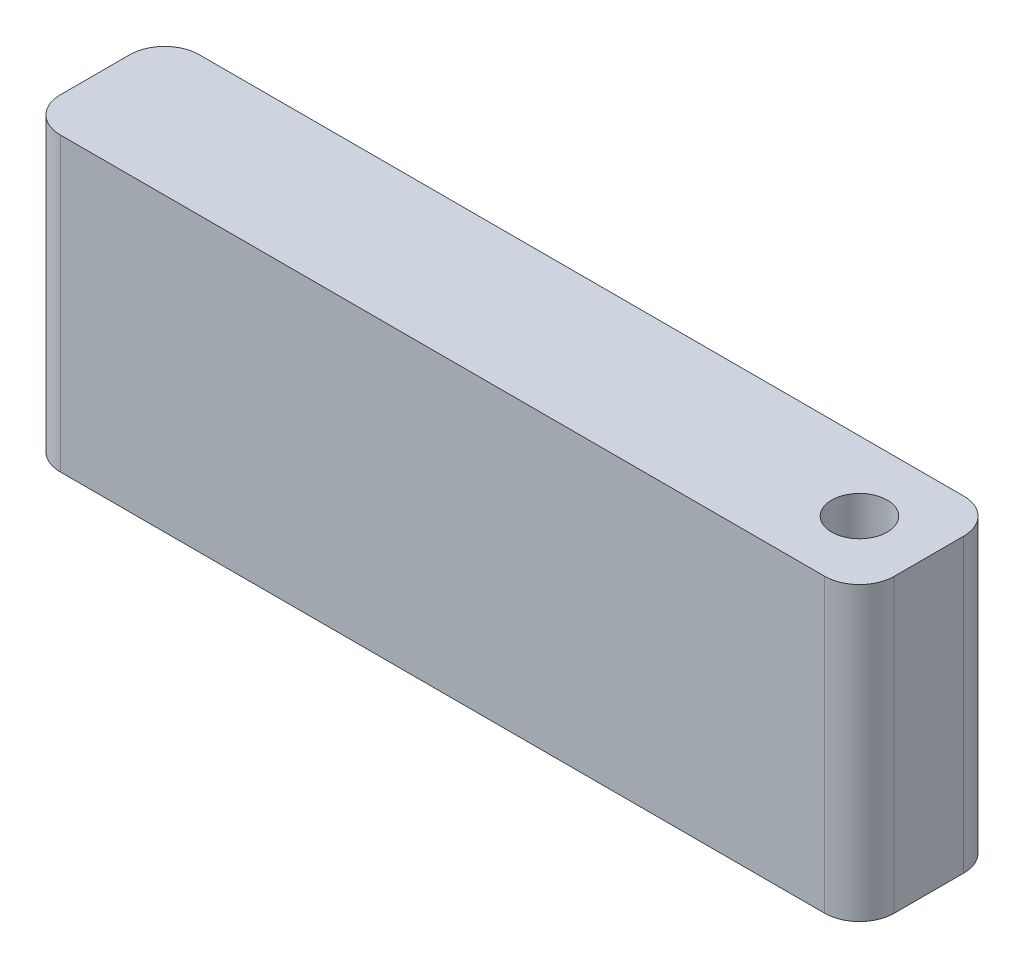
ISO-10303-21;
HEADER;
FILE_DESCRIPTION(('STEP AP214'),'2;1');
FILE_NAME('part.step','',(''),(''),'','','');
FILE_SCHEMA(('AUTOMOTIVE_DESIGN { 1 0 10303 214 1 1 1 1 }'));
ENDSEC;
DATA;
#1=APPLICATION_CONTEXT('core data for automotive mechanical design processes');
#2=APPLICATION_PROTOCOL_DEFINITION('international standard','automotive_design',2000,#1);
#3=PRODUCT_CONTEXT('',#1,'mechanical');
#4=PRODUCT('Part','Part','',(#3));
#5=PRODUCT_RELATED_PRODUCT_CATEGORY('part','',(#4));
#6=PRODUCT_DEFINITION_FORMATION('','',#4);
#7=PRODUCT_DEFINITION_CONTEXT('part definition',#1,'design');
#8=PRODUCT_DEFINITION('design','',#6,#7);
#9=PRODUCT_DEFINITION_SHAPE('','',#8);
#10=(LENGTH_UNIT() NAMED_UNIT(*) SI_UNIT(.MILLI.,.METRE.));
#11=(NAMED_UNIT(*) PLANE_ANGLE_UNIT() SI_UNIT($,.RADIAN.));
#12=(NAMED_UNIT(*) SI_UNIT($,.STERADIAN.) SOLID_ANGLE_UNIT());
#13=UNCERTAINTY_MEASURE_WITH_UNIT(LENGTH_MEASURE(1.E-05),#10,'distance_accuracy_value','');
#14=(GEOMETRIC_REPRESENTATION_CONTEXT(3) GLOBAL_UNCERTAINTY_ASSIGNED_CONTEXT((#13)) GLOBAL_UNIT_ASSIGNED_CONTEXT((#10,
#11,#12)) REPRESENTATION_CONTEXT('',''));
#15=CARTESIAN_POINT('',(0.,0.,0.));
#16=DIRECTION('',(0.,0.,1.));
#17=DIRECTION('',(1.,0.,0.));
#18=AXIS2_PLACEMENT_3D('',#15,#16,#17);
#19=CARTESIAN_POINT('',(55.,21.,-5.));
#20=DIRECTION('',(0.,-1.,0.));
#21=DIRECTION('',(0.,0.,-1.));
#22=AXIS2_PLACEMENT_3D('',#19,#20,#21);
#23=PLANE('',#22);
#24=CARTESIAN_POINT('',(55.,21.,-5.));
#25=DIRECTION('',(0.,1.,0.));
#26=DIRECTION('',(0.,0.,-1.));
#27=AXIS2_PLACEMENT_3D('',#24,#25,#26);
#28=CIRCLE('',#27,5.);
#29=CARTESIAN_POINT('',(60.,21.,-4.99999999999996));
#30=VERTEX_POINT('',#29);
#31=CARTESIAN_POINT('',(55.,21.,-10.));
#32=VERTEX_POINT('',#31);
#33=EDGE_CURVE('E146',#30,#32,#28,.T.);
#34=ORIENTED_EDGE('',*,*,#33,.T.);
#35=DIRECTION('',(-1.,0.,0.));
#36=VECTOR('',#35,1.);
#37=CARTESIAN_POINT('',(-55.,21.,-10.));
#38=LINE('',#37,#36);
#39=CARTESIAN_POINT('',(-55.,21.,-10.));
#40=VERTEX_POINT('',#39);
#41=EDGE_CURVE('E94',#32,#40,#38,.T.);
#42=ORIENTED_EDGE('',*,*,#41,.T.);
#43=CARTESIAN_POINT('',(-55.,21.,-5.));
#44=DIRECTION('',(0.,1.,0.));
#45=DIRECTION('',(0.,0.,-1.));
#46=AXIS2_PLACEMENT_3D('',#43,#44,#45);
#47=CIRCLE('',#46,5.);
#48=CARTESIAN_POINT('',(-60.,21.,-4.99999999999996));
#49=VERTEX_POINT('',#48);
#50=EDGE_CURVE('E161',#40,#49,#47,.T.);
#51=ORIENTED_EDGE('',*,*,#50,.T.);
#52=DIRECTION('',(0.,0.,1.));
#53=VECTOR('',#52,1.);
#54=CARTESIAN_POINT('',(-60.,21.,-4.99999999999996));
#55=LINE('',#54,#53);
#56=CARTESIAN_POINT('',(-60.,21.,4.99999999999997));
#57=VERTEX_POINT('',#56);
#58=EDGE_CURVE('E174',#49,#57,#55,.T.);
#59=ORIENTED_EDGE('',*,*,#58,.T.);
#60=CARTESIAN_POINT('',(-55.,21.,5.));
#61=DIRECTION('',(0.,1.,0.));
#62=DIRECTION('',(0.,0.,-1.));
#63=AXIS2_PLACEMENT_3D('',#60,#61,#62);
#64=CIRCLE('',#63,5.);
#65=CARTESIAN_POINT('',(-55.,21.,10.));
#66=VERTEX_POINT('',#65);
#67=EDGE_CURVE('E113',#57,#66,#64,.T.);
#68=ORIENTED_EDGE('',*,*,#67,.T.);
#69=DIRECTION('',(1.,0.,0.));
#70=VECTOR('',#69,1.);
#71=CARTESIAN_POINT('',(-55.,21.,10.));
#72=LINE('',#71,#70);
#73=CARTESIAN_POINT('',(55.,21.,10.));
#74=VERTEX_POINT('',#73);
#75=EDGE_CURVE('E107',#66,#74,#72,.T.);
#76=ORIENTED_EDGE('',*,*,#75,.T.);
#77=CARTESIAN_POINT('',(55.,21.,5.));
#78=DIRECTION('',(0.,1.,0.));
#79=DIRECTION('',(0.,0.,-1.));
#80=AXIS2_PLACEMENT_3D('',#77,#78,#79);
#81=CIRCLE('',#80,5.);
#82=CARTESIAN_POINT('',(60.,21.,4.99999999999997));
#83=VERTEX_POINT('',#82);
#84=EDGE_CURVE('E111',#74,#83,#81,.T.);
#85=ORIENTED_EDGE('',*,*,#84,.T.);
#86=DIRECTION('',(0.,0.,-1.));
#87=VECTOR('',#86,1.);
#88=CARTESIAN_POINT('',(60.,21.,-4.99999999999996));
#89=LINE('',#88,#87);
#90=EDGE_CURVE('E51',#83,#30,#89,.T.);
#91=ORIENTED_EDGE('',*,*,#90,.T.);
#92=EDGE_LOOP('',(#34,#42,#51,#59,#68,#76,#85,#91));
#93=FACE_BOUND('',#92,.T.);
#94=CARTESIAN_POINT('',(50.,21.,0.));
#95=DIRECTION('',(0.,1.,0.));
#96=DIRECTION('',(0.,0.,1.));
#97=AXIS2_PLACEMENT_3D('',#94,#95,#96);
#98=CIRCLE('',#97,4.);
#99=CARTESIAN_POINT('',(50.,21.,-4.));
#100=VERTEX_POINT('',#99);
#101=EDGE_CURVE('E135',#100,#100,#98,.T.);
#102=ORIENTED_EDGE('',*,*,#101,.F.);
#103=EDGE_LOOP('',(#102));
#104=FACE_BOUND('',#103,.T.);
#105=ADVANCED_FACE('F34',(#93,#104),#23,.F.);
#106=CARTESIAN_POINT('',(55.,-21.,-5.));
#107=DIRECTION('',(0.,-1.,0.));
#108=DIRECTION('',(0.,0.,-1.));
#109=AXIS2_PLACEMENT_3D('',#106,#107,#108);
#110=PLANE('',#109);
#111=CARTESIAN_POINT('',(55.,-21.,-5.));
#112=DIRECTION('',(0.,1.,0.));
#113=DIRECTION('',(0.,0.,-1.));
#114=AXIS2_PLACEMENT_3D('',#111,#112,#113);
#115=CIRCLE('',#114,5.);
#116=CARTESIAN_POINT('',(60.,-21.,-4.99999999999996));
#117=VERTEX_POINT('',#116);
#118=CARTESIAN_POINT('',(55.,-21.,-10.));
#119=VERTEX_POINT('',#118);
#120=EDGE_CURVE('E131',#117,#119,#115,.T.);
#121=ORIENTED_EDGE('',*,*,#120,.F.);
#122=DIRECTION('',(0.,0.,-1.));
#123=VECTOR('',#122,1.);
#124=CARTESIAN_POINT('',(60.,-21.,-4.99999999999996));
#125=LINE('',#124,#123);
#126=CARTESIAN_POINT('',(60.,-21.,4.99999999999997));
#127=VERTEX_POINT('',#126);
#128=EDGE_CURVE('E86',#127,#117,#125,.T.);
#129=ORIENTED_EDGE('',*,*,#128,.F.);
#130=CARTESIAN_POINT('',(55.,-21.,5.));
#131=DIRECTION('',(0.,1.,0.));
#132=DIRECTION('',(0.,0.,-1.));
#133=AXIS2_PLACEMENT_3D('',#130,#131,#132);
#134=CIRCLE('',#133,5.);
#135=CARTESIAN_POINT('',(55.,-21.,10.));
#136=VERTEX_POINT('',#135);
#137=EDGE_CURVE('E80',#136,#127,#134,.T.);
#138=ORIENTED_EDGE('',*,*,#137,.F.);
#139=DIRECTION('',(1.,0.,0.));
#140=VECTOR('',#139,1.);
#141=CARTESIAN_POINT('',(-55.,-21.,10.));
#142=LINE('',#141,#140);
#143=CARTESIAN_POINT('',(-55.,-21.,10.));
#144=VERTEX_POINT('',#143);
#145=EDGE_CURVE('E121',#144,#136,#142,.T.);
#146=ORIENTED_EDGE('',*,*,#145,.F.);
#147=CARTESIAN_POINT('',(-55.,-21.,5.));
#148=DIRECTION('',(0.,1.,0.));
#149=DIRECTION('',(0.,0.,-1.));
#150=AXIS2_PLACEMENT_3D('',#147,#148,#149);
#151=CIRCLE('',#150,5.);
#152=CARTESIAN_POINT('',(-60.,-21.,4.99999999999997));
#153=VERTEX_POINT('',#152);
#154=EDGE_CURVE('E141',#153,#144,#151,.T.);
#155=ORIENTED_EDGE('',*,*,#154,.F.);
#156=DIRECTION('',(0.,0.,1.));
#157=VECTOR('',#156,1.);
#158=CARTESIAN_POINT('',(-60.,-21.,-4.99999999999996));
#159=LINE('',#158,#157);
#160=CARTESIAN_POINT('',(-60.,-21.,-4.99999999999996));
#161=VERTEX_POINT('',#160);
#162=EDGE_CURVE('E139',#161,#153,#159,.T.);
#163=ORIENTED_EDGE('',*,*,#162,.F.);
#164=CARTESIAN_POINT('',(-55.,-21.,-5.));
#165=DIRECTION('',(0.,1.,0.));
#166=DIRECTION('',(0.,0.,-1.));
#167=AXIS2_PLACEMENT_3D('',#164,#165,#166);
#168=CIRCLE('',#167,5.);
#169=CARTESIAN_POINT('',(-55.,-21.,-10.));
#170=VERTEX_POINT('',#169);
#171=EDGE_CURVE('E137',#170,#161,#168,.T.);
#172=ORIENTED_EDGE('',*,*,#171,.F.);
#173=DIRECTION('',(-1.,0.,0.));
#174=VECTOR('',#173,1.);
#175=CARTESIAN_POINT('',(-55.,-21.,-10.));
#176=LINE('',#175,#174);
#177=EDGE_CURVE('E134',#119,#170,#176,.T.);
#178=ORIENTED_EDGE('',*,*,#177,.F.);
#179=EDGE_LOOP('',(#121,#129,#138,#146,#155,#163,#172,#178));
#180=FACE_BOUND('',#179,.T.);
#181=CARTESIAN_POINT('',(50.,-21.,0.));
#182=DIRECTION('',(0.,1.,0.));
#183=DIRECTION('',(0.,0.,1.));
#184=AXIS2_PLACEMENT_3D('',#181,#182,#183);
#185=CIRCLE('',#184,4.);
#186=CARTESIAN_POINT('',(50.,-21.,-4.));
#187=VERTEX_POINT('',#186);
#188=EDGE_CURVE('E180',#187,#187,#185,.T.);
#189=ORIENTED_EDGE('',*,*,#188,.T.);
#190=EDGE_LOOP('',(#189));
#191=FACE_BOUND('',#190,.T.);
#192=ADVANCED_FACE('F165',(#180,#191),#110,.T.);
#193=CARTESIAN_POINT('',(55.,21.,-5.));
#194=DIRECTION('',(0.,-1.,0.));
#195=DIRECTION('',(0.,0.,-1.));
#196=AXIS2_PLACEMENT_3D('',#193,#194,#195);
#197=CYLINDRICAL_SURFACE('',#196,5.);
#198=ORIENTED_EDGE('',*,*,#120,.T.);
#199=DIRECTION('',(0.,-1.,0.));
#200=VECTOR('',#199,1.);
#201=CARTESIAN_POINT('',(55.,21.,-10.));
#202=LINE('',#201,#200);
#203=EDGE_CURVE('E11',#32,#119,#202,.T.);
#204=ORIENTED_EDGE('',*,*,#203,.F.);
#205=ORIENTED_EDGE('',*,*,#33,.F.);
#206=DIRECTION('',(0.,-1.,0.));
#207=VECTOR('',#206,1.);
#208=CARTESIAN_POINT('',(60.,21.,-4.99999999999996));
#209=LINE('',#208,#207);
#210=EDGE_CURVE('E127',#30,#117,#209,.T.);
#211=ORIENTED_EDGE('',*,*,#210,.T.);
#212=EDGE_LOOP('',(#198,#204,#205,#211));
#213=FACE_BOUND('',#212,.T.);
#214=ADVANCED_FACE('F36',(#213),#197,.T.);
#215=CARTESIAN_POINT('',(-55.,21.,-10.));
#216=DIRECTION('',(0.,0.,1.));
#217=DIRECTION('',(1.,0.,0.));
#218=AXIS2_PLACEMENT_3D('',#215,#216,#217);
#219=PLANE('',#218);
#220=ORIENTED_EDGE('',*,*,#177,.T.);
#221=DIRECTION('',(0.,-1.,0.));
#222=VECTOR('',#221,1.);
#223=CARTESIAN_POINT('',(-55.,21.,-10.));
#224=LINE('',#223,#222);
#225=EDGE_CURVE('E43',#40,#170,#224,.T.);
#226=ORIENTED_EDGE('',*,*,#225,.F.);
#227=ORIENTED_EDGE('',*,*,#41,.F.);
#228=ORIENTED_EDGE('',*,*,#203,.T.);
#229=EDGE_LOOP('',(#220,#226,#227,#228));
#230=FACE_BOUND('',#229,.T.);
#231=ADVANCED_FACE('F208',(#230),#219,.F.);
#232=CARTESIAN_POINT('',(-55.,21.,-5.));
#233=DIRECTION('',(0.,-1.,0.));
#234=DIRECTION('',(0.,0.,-1.));
#235=AXIS2_PLACEMENT_3D('',#232,#233,#234);
#236=CYLINDRICAL_SURFACE('',#235,5.);
#237=ORIENTED_EDGE('',*,*,#171,.T.);
#238=DIRECTION('',(0.,-1.,0.));
#239=VECTOR('',#238,1.);
#240=CARTESIAN_POINT('',(-60.,21.,-4.99999999999996));
#241=LINE('',#240,#239);
#242=EDGE_CURVE('E153',#49,#161,#241,.T.);
#243=ORIENTED_EDGE('',*,*,#242,.F.);
#244=ORIENTED_EDGE('',*,*,#50,.F.);
#245=ORIENTED_EDGE('',*,*,#225,.T.);
#246=EDGE_LOOP('',(#237,#243,#244,#245));
#247=FACE_BOUND('',#246,.T.);
#248=ADVANCED_FACE('F159',(#247),#236,.T.);
#249=CARTESIAN_POINT('',(-60.,21.,-4.99999999999996));
#250=DIRECTION('',(1.,0.,0.));
#251=DIRECTION('',(0.,0.,-1.));
#252=AXIS2_PLACEMENT_3D('',#249,#250,#251);
#253=PLANE('',#252);
#254=ORIENTED_EDGE('',*,*,#162,.T.);
#255=DIRECTION('',(0.,-1.,0.));
#256=VECTOR('',#255,1.);
#257=CARTESIAN_POINT('',(-60.,21.,4.99999999999997));
#258=LINE('',#257,#256);
#259=EDGE_CURVE('E150',#57,#153,#258,.T.);
#260=ORIENTED_EDGE('',*,*,#259,.F.);
#261=ORIENTED_EDGE('',*,*,#58,.F.);
#262=ORIENTED_EDGE('',*,*,#242,.T.);
#263=EDGE_LOOP('',(#254,#260,#261,#262));
#264=FACE_BOUND('',#263,.T.);
#265=ADVANCED_FACE('F170',(#264),#253,.F.);
#266=CARTESIAN_POINT('',(-55.,21.,5.));
#267=DIRECTION('',(0.,-1.,0.));
#268=DIRECTION('',(0.,0.,-1.));
#269=AXIS2_PLACEMENT_3D('',#266,#267,#268);
#270=CYLINDRICAL_SURFACE('',#269,5.);
#271=ORIENTED_EDGE('',*,*,#154,.T.);
#272=DIRECTION('',(0.,-1.,0.));
#273=VECTOR('',#272,1.);
#274=CARTESIAN_POINT('',(-55.,21.,10.));
#275=LINE('',#274,#273);
#276=EDGE_CURVE('E122',#66,#144,#275,.T.);
#277=ORIENTED_EDGE('',*,*,#276,.F.);
#278=ORIENTED_EDGE('',*,*,#67,.F.);
#279=ORIENTED_EDGE('',*,*,#259,.T.);
#280=EDGE_LOOP('',(#271,#277,#278,#279));
#281=FACE_BOUND('',#280,.T.);
#282=ADVANCED_FACE('F173',(#281),#270,.T.);
#283=CARTESIAN_POINT('',(-55.,21.,10.));
#284=DIRECTION('',(0.,0.,-1.));
#285=DIRECTION('',(-1.,0.,0.));
#286=AXIS2_PLACEMENT_3D('',#283,#284,#285);
#287=PLANE('',#286);
#288=ORIENTED_EDGE('',*,*,#145,.T.);
#289=DIRECTION('',(0.,-1.,0.));
#290=VECTOR('',#289,1.);
#291=CARTESIAN_POINT('',(55.,21.,10.));
#292=LINE('',#291,#290);
#293=EDGE_CURVE('E118',#74,#136,#292,.T.);
#294=ORIENTED_EDGE('',*,*,#293,.F.);
#295=ORIENTED_EDGE('',*,*,#75,.F.);
#296=ORIENTED_EDGE('',*,*,#276,.T.);
#297=EDGE_LOOP('',(#288,#294,#295,#296));
#298=FACE_BOUND('',#297,.T.);
#299=ADVANCED_FACE('F119',(#298),#287,.F.);
#300=CARTESIAN_POINT('',(55.,21.,5.));
#301=DIRECTION('',(0.,-1.,0.));
#302=DIRECTION('',(0.,0.,-1.));
#303=AXIS2_PLACEMENT_3D('',#300,#301,#302);
#304=CYLINDRICAL_SURFACE('',#303,5.);
#305=ORIENTED_EDGE('',*,*,#137,.T.);
#306=DIRECTION('',(0.,-1.,0.));
#307=VECTOR('',#306,1.);
#308=CARTESIAN_POINT('',(60.,21.,4.99999999999997));
#309=LINE('',#308,#307);
#310=EDGE_CURVE('E123',#83,#127,#309,.T.);
#311=ORIENTED_EDGE('',*,*,#310,.F.);
#312=ORIENTED_EDGE('',*,*,#84,.F.);
#313=ORIENTED_EDGE('',*,*,#293,.T.);
#314=EDGE_LOOP('',(#305,#311,#312,#313));
#315=FACE_BOUND('',#314,.T.);
#316=ADVANCED_FACE('F125',(#315),#304,.T.);
#317=CARTESIAN_POINT('',(60.,21.,-4.99999999999996));
#318=DIRECTION('',(-1.,0.,0.));
#319=DIRECTION('',(0.,0.,1.));
#320=AXIS2_PLACEMENT_3D('',#317,#318,#319);
#321=PLANE('',#320);
#322=ORIENTED_EDGE('',*,*,#128,.T.);
#323=ORIENTED_EDGE('',*,*,#210,.F.);
#324=ORIENTED_EDGE('',*,*,#90,.F.);
#325=ORIENTED_EDGE('',*,*,#310,.T.);
#326=EDGE_LOOP('',(#322,#323,#324,#325));
#327=FACE_BOUND('',#326,.T.);
#328=ADVANCED_FACE('F196',(#327),#321,.F.);
#329=CARTESIAN_POINT('',(50.,21.,0.));
#330=DIRECTION('',(0.,-1.,0.));
#331=DIRECTION('',(0.,0.,-1.));
#332=AXIS2_PLACEMENT_3D('',#329,#330,#331);
#333=CYLINDRICAL_SURFACE('',#332,4.);
#334=CARTESIAN_POINT('',(50.,21.,-4.));
#335=CARTESIAN_POINT('',(50.,20.5625,-4.));
#336=CARTESIAN_POINT('',(50.,20.125,-4.));
#337=CARTESIAN_POINT('',(50.,19.25,-4.));
#338=CARTESIAN_POINT('',(50.,18.8125,-4.));
#339=CARTESIAN_POINT('',(50.,17.9375,-4.));
#340=CARTESIAN_POINT('',(50.,17.5,-4.));
#341=CARTESIAN_POINT('',(50.,16.625,-4.));
#342=CARTESIAN_POINT('',(50.,16.1875,-4.));
#343=CARTESIAN_POINT('',(50.,15.3125,-4.));
#344=CARTESIAN_POINT('',(50.,14.875,-4.));
#345=CARTESIAN_POINT('',(50.,14.,-4.));
#346=CARTESIAN_POINT('',(50.,13.5625,-4.));
#347=CARTESIAN_POINT('',(50.,12.6875,-4.));
#348=CARTESIAN_POINT('',(50.,12.25,-4.));
#349=CARTESIAN_POINT('',(50.,11.375,-4.));
#350=CARTESIAN_POINT('',(50.,10.9375,-4.));
#351=CARTESIAN_POINT('',(50.,10.0625,-4.));
#352=CARTESIAN_POINT('',(50.,9.625,-4.));
#353=CARTESIAN_POINT('',(50.,8.75,-4.));
#354=CARTESIAN_POINT('',(50.,8.3125,-4.));
#355=CARTESIAN_POINT('',(50.,7.4375,-4.));
#356=CARTESIAN_POINT('',(50.,7.,-4.));
#357=CARTESIAN_POINT('',(50.,6.125,-4.));
#358=CARTESIAN_POINT('',(50.,5.6875,-4.));
#359=CARTESIAN_POINT('',(50.,4.8125,-4.));
#360=CARTESIAN_POINT('',(50.,4.375,-4.));
#361=CARTESIAN_POINT('',(50.,3.5,-4.));
#362=CARTESIAN_POINT('',(50.,3.0625,-4.));
#363=CARTESIAN_POINT('',(50.,2.1875,-4.));
#364=CARTESIAN_POINT('',(50.,1.75,-4.));
#365=CARTESIAN_POINT('',(50.,0.875000000000001,-4.));
#366=CARTESIAN_POINT('',(50.,0.4375,-4.));
#367=CARTESIAN_POINT('',(50.,-0.4375,-4.));
#368=CARTESIAN_POINT('',(50.,-0.875000000000001,-4.));
#369=CARTESIAN_POINT('',(50.,-1.75,-4.));
#370=CARTESIAN_POINT('',(50.,-2.1875,-4.));
#371=CARTESIAN_POINT('',(50.,-3.0625,-4.));
#372=CARTESIAN_POINT('',(50.,-3.5,-4.));
#373=CARTESIAN_POINT('',(50.,-4.375,-4.));
#374=CARTESIAN_POINT('',(50.,-4.8125,-4.));
#375=CARTESIAN_POINT('',(50.,-5.6875,-4.));
#376=CARTESIAN_POINT('',(50.,-6.125,-4.));
#377=CARTESIAN_POINT('',(50.,-7.,-4.));
#378=CARTESIAN_POINT('',(50.,-7.4375,-4.));
#379=CARTESIAN_POINT('',(50.,-8.3125,-4.));
#380=CARTESIAN_POINT('',(50.,-8.75,-4.));
#381=CARTESIAN_POINT('',(50.,-9.625,-4.));
#382=CARTESIAN_POINT('',(50.,-10.0625,-4.));
#383=CARTESIAN_POINT('',(50.,-10.9375,-4.));
#384=CARTESIAN_POINT('',(50.,-11.375,-4.));
#385=CARTESIAN_POINT('',(50.,-12.25,-4.));
#386=CARTESIAN_POINT('',(50.,-12.6875,-4.));
#387=CARTESIAN_POINT('',(50.,-13.5625,-4.));
#388=CARTESIAN_POINT('',(50.,-14.,-4.));
#389=CARTESIAN_POINT('',(50.,-14.875,-4.));
#390=CARTESIAN_POINT('',(50.,-15.3125,-4.));
#391=CARTESIAN_POINT('',(50.,-16.1875,-4.));
#392=CARTESIAN_POINT('',(50.,-16.625,-4.));
#393=CARTESIAN_POINT('',(50.,-17.5,-4.));
#394=CARTESIAN_POINT('',(50.,-17.9375,-4.));
#395=CARTESIAN_POINT('',(50.,-18.8125,-4.));
#396=CARTESIAN_POINT('',(50.,-19.25,-4.));
#397=CARTESIAN_POINT('',(50.,-20.125,-4.));
#398=CARTESIAN_POINT('',(50.,-20.5625,-4.));
#399=CARTESIAN_POINT('',(50.,-21.,-4.));
#400=B_SPLINE_CURVE_WITH_KNOTS('',3,(#334,#335,#336,#337,#338,#339,#340,#341,#342,#343,#344,
#345,#346,#347,#348,#349,#350,#351,#352,#353,#354,#355,#356,#357,#358,#359,#360,#361,#362,#363,
#364,#365,#366,#367,#368,#369,#370,#371,#372,#373,#374,#375,#376,#377,#378,#379,#380,#381,#382,
#383,#384,#385,#386,#387,#388,#389,#390,#391,#392,#393,#394,#395,#396,#397,#398,#399),
.UNSPECIFIED.,.F.,.F.,(4,2,2,2,2,2,2,2,2,2,2,2,2,2,2,2,2,2,2,2,2,2,2,2,2,2,2,2,2,2,2,2,4),(0.,
1.3125,2.625,3.9375,5.25,6.5625,7.875,9.1875,10.5,11.8125,13.125,14.4375,15.75,17.0625,18.375,
19.6875,21.,22.3125,23.625,24.9375,26.25,27.5625,28.875,30.1875,31.5,32.8125,34.125,35.4375,
36.75,38.0625,39.375,40.6875,42.),.UNSPECIFIED.);
#401=EDGE_CURVE('BSEAM186',#100,#187,#400,.T.);
#402=ORIENTED_EDGE('',*,*,#101,.T.);
#403=ORIENTED_EDGE('',*,*,#188,.F.);
#404=ORIENTED_EDGE('',*,*,#401,.T.);
#405=ORIENTED_EDGE('',*,*,#401,.F.);
#406=EDGE_LOOP('',(#402,#404,#403,#405));
#407=FACE_BOUND('',#406,.T.);
#408=ADVANCED_FACE('F186',(#407),#333,.F.);
#409=CLOSED_SHELL('',(#105,#192,#214,#231,#248,#265,#282,#299,#316,#328,#408));
#410=MANIFOLD_SOLID_BREP('B2',#409);
#411=ADVANCED_BREP_SHAPE_REPRESENTATION('',(#18,#410),#14);
#412=SHAPE_DEFINITION_REPRESENTATION(#9,#411);
ENDSEC;
END-ISO-10303-21;
